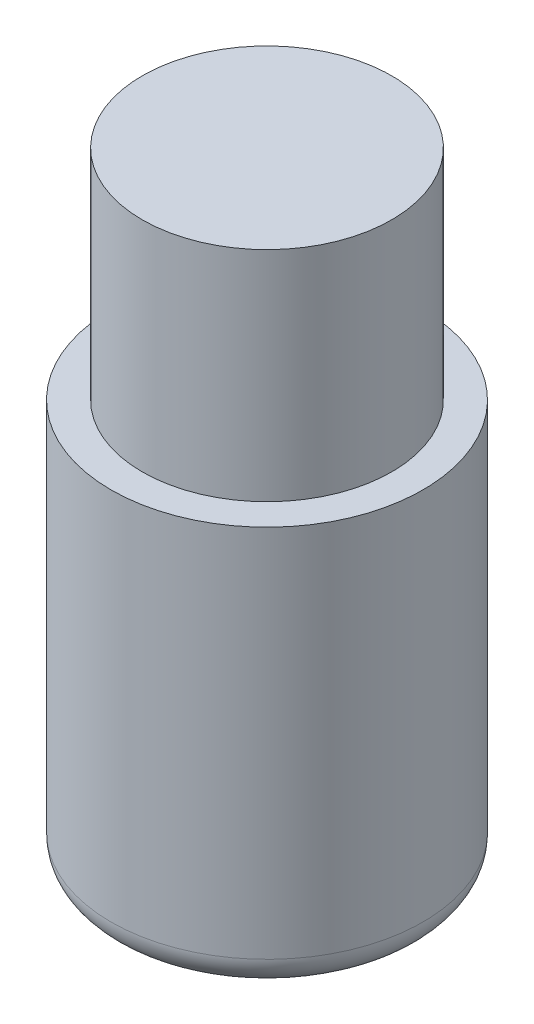
ISO-10303-21;
HEADER;
FILE_DESCRIPTION(('STEP AP214'),'2;1');
FILE_NAME('part.step','',(''),(''),'','','');
FILE_SCHEMA(('AUTOMOTIVE_DESIGN { 1 0 10303 214 1 1 1 1 }'));
ENDSEC;
DATA;
#1=APPLICATION_CONTEXT('core data for automotive mechanical design processes');
#2=APPLICATION_PROTOCOL_DEFINITION('international standard','automotive_design',2000,#1);
#3=PRODUCT_CONTEXT('',#1,'mechanical');
#4=PRODUCT('Part','Part','',(#3));
#5=PRODUCT_RELATED_PRODUCT_CATEGORY('part','',(#4));
#6=PRODUCT_DEFINITION_FORMATION('','',#4);
#7=PRODUCT_DEFINITION_CONTEXT('part definition',#1,'design');
#8=PRODUCT_DEFINITION('design','',#6,#7);
#9=PRODUCT_DEFINITION_SHAPE('','',#8);
#10=(LENGTH_UNIT() NAMED_UNIT(*) SI_UNIT(.MILLI.,.METRE.));
#11=(NAMED_UNIT(*) PLANE_ANGLE_UNIT() SI_UNIT($,.RADIAN.));
#12=(NAMED_UNIT(*) SI_UNIT($,.STERADIAN.) SOLID_ANGLE_UNIT());
#13=UNCERTAINTY_MEASURE_WITH_UNIT(LENGTH_MEASURE(1.E-05),#10,'distance_accuracy_value','');
#14=(GEOMETRIC_REPRESENTATION_CONTEXT(3) GLOBAL_UNCERTAINTY_ASSIGNED_CONTEXT((#13)) GLOBAL_UNIT_ASSIGNED_CONTEXT((#10,
#11,#12)) REPRESENTATION_CONTEXT('',''));
#15=CARTESIAN_POINT('',(0.,0.,0.));
#16=DIRECTION('',(0.,0.,1.));
#17=DIRECTION('',(1.,0.,0.));
#18=AXIS2_PLACEMENT_3D('',#15,#16,#17);
#19=CARTESIAN_POINT('',(0.,13.,0.));
#20=DIRECTION('',(0.,-1.,0.));
#21=DIRECTION('',(0.,0.,-1.));
#22=AXIS2_PLACEMENT_3D('',#19,#20,#21);
#23=CYLINDRICAL_SURFACE('',#22,5.);
#24=CARTESIAN_POINT('',(0.,1.,0.));
#25=DIRECTION('',(0.,1.,0.));
#26=DIRECTION('',(0.,0.,1.));
#27=AXIS2_PLACEMENT_3D('',#24,#25,#26);
#28=CIRCLE('',#27,5.);
#29=CARTESIAN_POINT('',(0.,0.999999999999999,-5.));
#30=VERTEX_POINT('',#29);
#31=EDGE_CURVE('E42',#30,#30,#28,.T.);
#32=CARTESIAN_POINT('',(0.,13.,0.));
#33=DIRECTION('',(0.,1.,0.));
#34=DIRECTION('',(0.,0.,1.));
#35=AXIS2_PLACEMENT_3D('',#32,#33,#34);
#36=CIRCLE('',#35,5.);
#37=CARTESIAN_POINT('',(0.,13.,-5.));
#38=VERTEX_POINT('',#37);
#39=EDGE_CURVE('E46',#38,#38,#36,.T.);
#40=CARTESIAN_POINT('',(0.,0.999999999999999,-5.));
#41=CARTESIAN_POINT('',(0.,1.125,-5.));
#42=CARTESIAN_POINT('',(0.,1.25,-5.));
#43=CARTESIAN_POINT('',(0.,1.5,-5.));
#44=CARTESIAN_POINT('',(0.,1.625,-5.));
#45=CARTESIAN_POINT('',(0.,1.875,-5.));
#46=CARTESIAN_POINT('',(0.,2.,-5.));
#47=CARTESIAN_POINT('',(0.,2.25,-5.));
#48=CARTESIAN_POINT('',(0.,2.375,-5.));
#49=CARTESIAN_POINT('',(0.,2.625,-5.));
#50=CARTESIAN_POINT('',(0.,2.75,-5.));
#51=CARTESIAN_POINT('',(0.,3.,-5.));
#52=CARTESIAN_POINT('',(0.,3.125,-5.));
#53=CARTESIAN_POINT('',(0.,3.375,-5.));
#54=CARTESIAN_POINT('',(0.,3.5,-5.));
#55=CARTESIAN_POINT('',(0.,3.75,-5.));
#56=CARTESIAN_POINT('',(0.,3.875,-5.));
#57=CARTESIAN_POINT('',(0.,4.125,-5.));
#58=CARTESIAN_POINT('',(0.,4.25,-5.));
#59=CARTESIAN_POINT('',(0.,4.5,-5.));
#60=CARTESIAN_POINT('',(0.,4.625,-5.));
#61=CARTESIAN_POINT('',(0.,4.875,-5.));
#62=CARTESIAN_POINT('',(0.,5.,-5.));
#63=CARTESIAN_POINT('',(0.,5.25,-5.));
#64=CARTESIAN_POINT('',(0.,5.375,-5.));
#65=CARTESIAN_POINT('',(0.,5.625,-5.));
#66=CARTESIAN_POINT('',(0.,5.75,-5.));
#67=CARTESIAN_POINT('',(0.,6.,-5.));
#68=CARTESIAN_POINT('',(0.,6.125,-5.));
#69=CARTESIAN_POINT('',(0.,6.375,-5.));
#70=CARTESIAN_POINT('',(0.,6.5,-5.));
#71=CARTESIAN_POINT('',(0.,6.75,-5.));
#72=CARTESIAN_POINT('',(0.,6.875,-5.));
#73=CARTESIAN_POINT('',(0.,7.125,-5.));
#74=CARTESIAN_POINT('',(0.,7.25,-5.));
#75=CARTESIAN_POINT('',(0.,7.5,-5.));
#76=CARTESIAN_POINT('',(0.,7.625,-5.));
#77=CARTESIAN_POINT('',(0.,7.875,-5.));
#78=CARTESIAN_POINT('',(0.,8.,-5.));
#79=CARTESIAN_POINT('',(0.,8.25,-5.));
#80=CARTESIAN_POINT('',(0.,8.375,-5.));
#81=CARTESIAN_POINT('',(0.,8.625,-5.));
#82=CARTESIAN_POINT('',(0.,8.75,-5.));
#83=CARTESIAN_POINT('',(0.,9.,-5.));
#84=CARTESIAN_POINT('',(0.,9.125,-5.));
#85=CARTESIAN_POINT('',(0.,9.375,-5.));
#86=CARTESIAN_POINT('',(0.,9.5,-5.));
#87=CARTESIAN_POINT('',(0.,9.75,-5.));
#88=CARTESIAN_POINT('',(0.,9.875,-5.));
#89=CARTESIAN_POINT('',(0.,10.125,-5.));
#90=CARTESIAN_POINT('',(0.,10.25,-5.));
#91=CARTESIAN_POINT('',(0.,10.5,-5.));
#92=CARTESIAN_POINT('',(0.,10.625,-5.));
#93=CARTESIAN_POINT('',(0.,10.875,-5.));
#94=CARTESIAN_POINT('',(0.,11.,-5.));
#95=CARTESIAN_POINT('',(0.,11.25,-5.));
#96=CARTESIAN_POINT('',(0.,11.375,-5.));
#97=CARTESIAN_POINT('',(0.,11.625,-5.));
#98=CARTESIAN_POINT('',(0.,11.75,-5.));
#99=CARTESIAN_POINT('',(0.,12.,-5.));
#100=CARTESIAN_POINT('',(0.,12.125,-5.));
#101=CARTESIAN_POINT('',(0.,12.375,-5.));
#102=CARTESIAN_POINT('',(0.,12.5,-5.));
#103=CARTESIAN_POINT('',(0.,12.75,-5.));
#104=CARTESIAN_POINT('',(0.,12.875,-5.));
#105=CARTESIAN_POINT('',(0.,13.,-5.));
#106=B_SPLINE_CURVE_WITH_KNOTS('',3,(#40,#41,#42,#43,#44,#45,#46,#47,#48,#49,#50,#51,#52,#53,
#54,#55,#56,#57,#58,#59,#60,#61,#62,#63,#64,#65,#66,#67,#68,#69,#70,#71,#72,#73,#74,#75,#76,#77,
#78,#79,#80,#81,#82,#83,#84,#85,#86,#87,#88,#89,#90,#91,#92,#93,#94,#95,#96,#97,#98,#99,#100,
#101,#102,#103,#104,#105),.UNSPECIFIED.,.F.,.F.,(4,2,2,2,2,2,2,2,2,2,2,2,2,2,2,2,2,2,2,2,2,2,2,
2,2,2,2,2,2,2,2,2,4),(0.,0.375,0.750000000000001,1.125,1.5,1.875,2.25,2.625,3.,3.375,3.75,4.125,
4.5,4.875,5.25,5.625,6.,6.375,6.75,7.125,7.5,7.875,8.25,8.625,9.,9.375,9.75,10.125,10.5,10.875,
11.25,11.625,12.),.UNSPECIFIED.);
#107=EDGE_CURVE('BSEAM30',#30,#38,#106,.T.);
#108=ORIENTED_EDGE('',*,*,#31,.T.);
#109=ORIENTED_EDGE('',*,*,#39,.F.);
#110=ORIENTED_EDGE('',*,*,#107,.T.);
#111=ORIENTED_EDGE('',*,*,#107,.F.);
#112=EDGE_LOOP('',(#108,#110,#109,#111));
#113=FACE_BOUND('',#112,.T.);
#114=ADVANCED_FACE('F30',(#113),#23,.T.);
#115=CARTESIAN_POINT('',(0.,13.,0.));
#116=DIRECTION('',(0.,1.,0.));
#117=DIRECTION('',(0.,0.,1.));
#118=AXIS2_PLACEMENT_3D('',#115,#116,#117);
#119=PLANE('',#118);
#120=CARTESIAN_POINT('',(0.,13.,0.));
#121=DIRECTION('',(0.,1.,0.));
#122=DIRECTION('',(0.,0.,1.));
#123=AXIS2_PLACEMENT_3D('',#120,#121,#122);
#124=CIRCLE('',#123,4.);
#125=CARTESIAN_POINT('',(0.,13.,4.));
#126=VERTEX_POINT('',#125);
#127=EDGE_CURVE('E10',#126,#126,#124,.T.);
#128=ORIENTED_EDGE('',*,*,#127,.F.);
#129=EDGE_LOOP('',(#128));
#130=FACE_BOUND('',#129,.T.);
#131=ORIENTED_EDGE('',*,*,#39,.T.);
#132=EDGE_LOOP('',(#131));
#133=FACE_BOUND('',#132,.T.);
#134=ADVANCED_FACE('F64',(#130,#133),#119,.T.);
#135=CARTESIAN_POINT('',(0.,0.,0.));
#136=DIRECTION('',(0.,1.,0.));
#137=DIRECTION('',(0.,0.,1.));
#138=AXIS2_PLACEMENT_3D('',#135,#136,#137);
#139=PLANE('',#138);
#140=CARTESIAN_POINT('',(0.,0.,0.));
#141=DIRECTION('',(0.,1.,0.));
#142=DIRECTION('',(0.,0.,1.));
#143=AXIS2_PLACEMENT_3D('',#140,#141,#142);
#144=CIRCLE('',#143,4.);
#145=CARTESIAN_POINT('',(0.,0.,4.));
#146=VERTEX_POINT('',#145);
#147=EDGE_CURVE('E34',#146,#146,#144,.F.);
#148=ORIENTED_EDGE('',*,*,#147,.T.);
#149=EDGE_LOOP('',(#148));
#150=FACE_BOUND('',#149,.T.);
#151=ADVANCED_FACE('F55',(#150),#139,.F.);
#152=CARTESIAN_POINT('',(0.,1.,0.));
#153=DIRECTION('',(0.,1.,0.));
#154=DIRECTION('',(0.,0.,1.));
#155=AXIS2_PLACEMENT_3D('',#152,#153,#154);
#156=TOROIDAL_SURFACE('',#155,4.,1.);
#157=ORIENTED_EDGE('',*,*,#147,.F.);
#158=EDGE_LOOP('',(#157));
#159=FACE_BOUND('',#158,.T.);
#160=ORIENTED_EDGE('',*,*,#31,.F.);
#161=EDGE_LOOP('',(#160));
#162=FACE_BOUND('',#161,.T.);
#163=ADVANCED_FACE('F32',(#159,#162),#156,.T.);
#164=CARTESIAN_POINT('',(0.,20.,0.));
#165=DIRECTION('',(0.,-1.,0.));
#166=DIRECTION('',(0.,0.,-1.));
#167=AXIS2_PLACEMENT_3D('',#164,#165,#166);
#168=CYLINDRICAL_SURFACE('',#167,4.);
#169=CARTESIAN_POINT('',(0.,20.,0.));
#170=DIRECTION('',(0.,1.,0.));
#171=DIRECTION('',(0.,0.,1.));
#172=AXIS2_PLACEMENT_3D('',#169,#170,#171);
#173=CIRCLE('',#172,4.);
#174=CARTESIAN_POINT('',(0.,20.,4.));
#175=VERTEX_POINT('',#174);
#176=EDGE_CURVE('E45',#175,#175,#173,.T.);
#177=ORIENTED_EDGE('',*,*,#176,.F.);
#178=EDGE_LOOP('',(#177));
#179=FACE_BOUND('',#178,.T.);
#180=ORIENTED_EDGE('',*,*,#127,.T.);
#181=EDGE_LOOP('',(#180));
#182=FACE_BOUND('',#181,.T.);
#183=ADVANCED_FACE('F54',(#179,#182),#168,.T.);
#184=CARTESIAN_POINT('',(0.,20.,0.));
#185=DIRECTION('',(0.,1.,0.));
#186=DIRECTION('',(0.,0.,1.));
#187=AXIS2_PLACEMENT_3D('',#184,#185,#186);
#188=PLANE('',#187);
#189=ORIENTED_EDGE('',*,*,#176,.T.);
#190=EDGE_LOOP('',(#189));
#191=FACE_BOUND('',#190,.T.);
#192=ADVANCED_FACE('F61',(#191),#188,.T.);
#193=CLOSED_SHELL('',(#114,#134,#151,#163,#183,#192));
#194=MANIFOLD_SOLID_BREP('B2',#193);
#195=ADVANCED_BREP_SHAPE_REPRESENTATION('',(#18,#194),#14);
#196=SHAPE_DEFINITION_REPRESENTATION(#9,#195);
ENDSEC;
END-ISO-10303-21;
